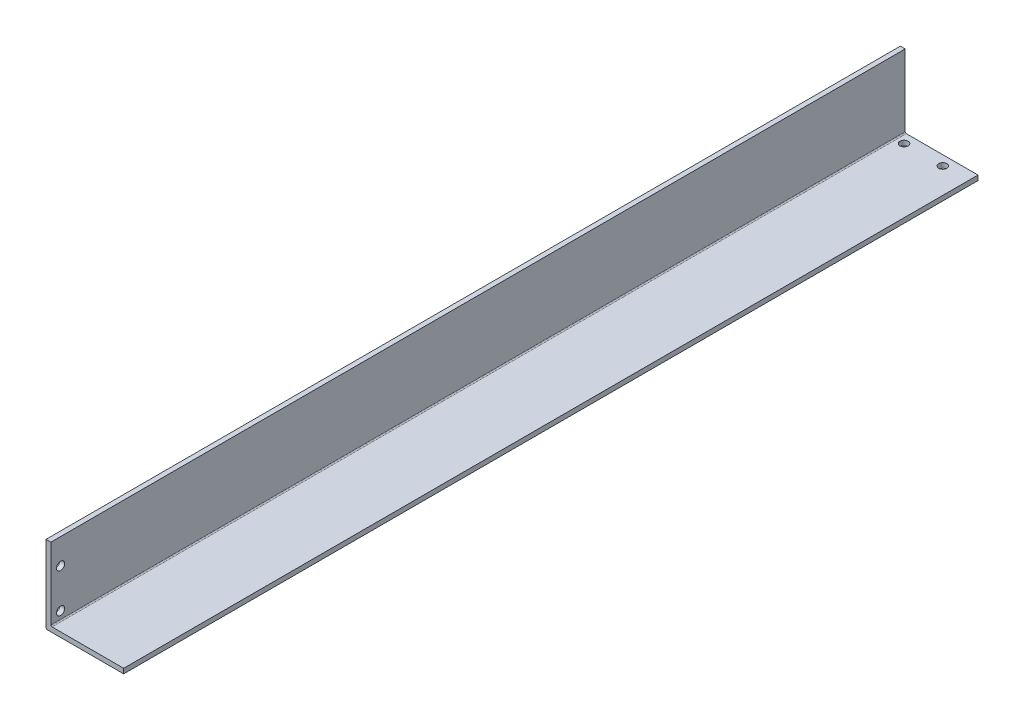
ISO-10303-21;
HEADER;
FILE_DESCRIPTION(('STEP AP214'),'2;1');
FILE_NAME('part.step','',(''),(''),'','','');
FILE_SCHEMA(('AUTOMOTIVE_DESIGN { 1 0 10303 214 1 1 1 1 }'));
ENDSEC;
DATA;
#1=APPLICATION_CONTEXT('core data for automotive mechanical design processes');
#2=APPLICATION_PROTOCOL_DEFINITION('international standard','automotive_design',2000,#1);
#3=PRODUCT_CONTEXT('',#1,'mechanical');
#4=PRODUCT('Part','Part','',(#3));
#5=PRODUCT_RELATED_PRODUCT_CATEGORY('part','',(#4));
#6=PRODUCT_DEFINITION_FORMATION('','',#4);
#7=PRODUCT_DEFINITION_CONTEXT('part definition',#1,'design');
#8=PRODUCT_DEFINITION('design','',#6,#7);
#9=PRODUCT_DEFINITION_SHAPE('','',#8);
#10=(LENGTH_UNIT() NAMED_UNIT(*) SI_UNIT(.MILLI.,.METRE.));
#11=(NAMED_UNIT(*) PLANE_ANGLE_UNIT() SI_UNIT($,.RADIAN.));
#12=(NAMED_UNIT(*) SI_UNIT($,.STERADIAN.) SOLID_ANGLE_UNIT());
#13=UNCERTAINTY_MEASURE_WITH_UNIT(LENGTH_MEASURE(1.E-05),#10,'distance_accuracy_value','');
#14=(GEOMETRIC_REPRESENTATION_CONTEXT(3) GLOBAL_UNCERTAINTY_ASSIGNED_CONTEXT((#13)) GLOBAL_UNIT_ASSIGNED_CONTEXT((#10,
#11,#12)) REPRESENTATION_CONTEXT('',''));
#15=CARTESIAN_POINT('',(0.,0.,0.));
#16=DIRECTION('',(0.,0.,1.));
#17=DIRECTION('',(1.,0.,0.));
#18=AXIS2_PLACEMENT_3D('',#15,#16,#17);
#19=CARTESIAN_POINT('',(0.,50.8,558.8));
#20=DIRECTION('',(0.,-1.,0.));
#21=DIRECTION('',(0.,0.,-1.));
#22=AXIS2_PLACEMENT_3D('',#19,#20,#21);
#23=PLANE('',#22);
#24=DIRECTION('',(-1.,0.,0.));
#25=VECTOR('',#24,1.);
#26=CARTESIAN_POINT('',(0.,50.8,0.));
#27=LINE('',#26,#25);
#28=CARTESIAN_POINT('',(3.17499999999999,50.8,0.));
#29=VERTEX_POINT('',#28);
#30=CARTESIAN_POINT('',(0.,50.8,0.));
#31=VERTEX_POINT('',#30);
#32=EDGE_CURVE('E129',#29,#31,#27,.T.);
#33=ORIENTED_EDGE('',*,*,#32,.T.);
#34=DIRECTION('',(0.,0.,-1.));
#35=VECTOR('',#34,1.);
#36=CARTESIAN_POINT('',(0.,50.8,558.8));
#37=LINE('',#36,#35);
#38=CARTESIAN_POINT('',(0.,50.8,558.8));
#39=VERTEX_POINT('',#38);
#40=EDGE_CURVE('E11',#39,#31,#37,.T.);
#41=ORIENTED_EDGE('',*,*,#40,.F.);
#42=DIRECTION('',(-1.,0.,0.));
#43=VECTOR('',#42,1.);
#44=CARTESIAN_POINT('',(0.,50.8,558.8));
#45=LINE('',#44,#43);
#46=CARTESIAN_POINT('',(3.17499999999999,50.8,558.8));
#47=VERTEX_POINT('',#46);
#48=EDGE_CURVE('E144',#47,#39,#45,.T.);
#49=ORIENTED_EDGE('',*,*,#48,.F.);
#50=DIRECTION('',(0.,0.,-1.));
#51=VECTOR('',#50,1.);
#52=CARTESIAN_POINT('',(3.17499999999999,50.8,558.8));
#53=LINE('',#52,#51);
#54=EDGE_CURVE('E125',#47,#29,#53,.T.);
#55=ORIENTED_EDGE('',*,*,#54,.T.);
#56=EDGE_LOOP('',(#33,#41,#49,#55));
#57=FACE_BOUND('',#56,.T.);
#58=ADVANCED_FACE('F33',(#57),#23,.F.);
#59=CARTESIAN_POINT('',(0.,0.762000000000005,558.8));
#60=DIRECTION('',(1.,0.,0.));
#61=DIRECTION('',(0.,0.,-1.));
#62=AXIS2_PLACEMENT_3D('',#59,#60,#61);
#63=PLANE('',#62);
#64=CARTESIAN_POINT('',(0.,8.763,552.45));
#65=DIRECTION('',(1.,0.,0.));
#66=DIRECTION('',(0.,1.,0.));
#67=AXIS2_PLACEMENT_3D('',#64,#65,#66);
#68=CIRCLE('',#67,2.66700000000002);
#69=CARTESIAN_POINT('',(0.,11.43,552.45));
#70=VERTEX_POINT('',#69);
#71=EDGE_CURVE('E195',#70,#70,#68,.T.);
#72=ORIENTED_EDGE('',*,*,#71,.T.);
#73=EDGE_LOOP('',(#72));
#74=FACE_BOUND('',#73,.T.);
#75=CARTESIAN_POINT('',(0.,34.163,552.45));
#76=DIRECTION('',(1.,0.,0.));
#77=DIRECTION('',(0.,1.,0.));
#78=AXIS2_PLACEMENT_3D('',#75,#76,#77);
#79=CIRCLE('',#78,2.66700000000002);
#80=CARTESIAN_POINT('',(0.,36.83,552.45));
#81=VERTEX_POINT('',#80);
#82=EDGE_CURVE('E186',#81,#81,#79,.T.);
#83=ORIENTED_EDGE('',*,*,#82,.T.);
#84=EDGE_LOOP('',(#83));
#85=FACE_BOUND('',#84,.T.);
#86=DIRECTION('',(0.,-1.,0.));
#87=VECTOR('',#86,1.);
#88=CARTESIAN_POINT('',(0.,0.762000000000005,0.));
#89=LINE('',#88,#87);
#90=CARTESIAN_POINT('',(0.,0.762000000000005,0.));
#91=VERTEX_POINT('',#90);
#92=EDGE_CURVE('E132',#31,#91,#89,.T.);
#93=ORIENTED_EDGE('',*,*,#92,.T.);
#94=DIRECTION('',(0.,0.,-1.));
#95=VECTOR('',#94,1.);
#96=CARTESIAN_POINT('',(0.,0.762000000000005,558.8));
#97=LINE('',#96,#95);
#98=CARTESIAN_POINT('',(0.,0.762000000000005,558.8));
#99=VERTEX_POINT('',#98);
#100=EDGE_CURVE('E41',#99,#91,#97,.T.);
#101=ORIENTED_EDGE('',*,*,#100,.F.);
#102=DIRECTION('',(0.,-1.,0.));
#103=VECTOR('',#102,1.);
#104=CARTESIAN_POINT('',(0.,0.762000000000005,558.8));
#105=LINE('',#104,#103);
#106=EDGE_CURVE('E92',#39,#99,#105,.T.);
#107=ORIENTED_EDGE('',*,*,#106,.F.);
#108=ORIENTED_EDGE('',*,*,#40,.T.);
#109=EDGE_LOOP('',(#93,#101,#107,#108));
#110=FACE_BOUND('',#109,.T.);
#111=ADVANCED_FACE('F225',(#74,#85,#110),#63,.F.);
#112=CARTESIAN_POINT('',(0.762,0.762,558.8));
#113=DIRECTION('',(0.,0.,-1.));
#114=DIRECTION('',(-1.,0.,0.));
#115=AXIS2_PLACEMENT_3D('',#112,#113,#114);
#116=CYLINDRICAL_SURFACE('',#115,0.762);
#117=CARTESIAN_POINT('',(0.762,0.762,0.));
#118=DIRECTION('',(0.,0.,1.));
#119=DIRECTION('',(1.,0.,0.));
#120=AXIS2_PLACEMENT_3D('',#117,#118,#119);
#121=CIRCLE('',#120,0.762);
#122=CARTESIAN_POINT('',(0.762000000000005,0.,0.));
#123=VERTEX_POINT('',#122);
#124=EDGE_CURVE('E135',#91,#123,#121,.T.);
#125=ORIENTED_EDGE('',*,*,#124,.T.);
#126=DIRECTION('',(0.,0.,-1.));
#127=VECTOR('',#126,1.);
#128=CARTESIAN_POINT('',(0.762000000000005,0.,558.8));
#129=LINE('',#128,#127);
#130=CARTESIAN_POINT('',(0.762000000000005,0.,558.8));
#131=VERTEX_POINT('',#130);
#132=EDGE_CURVE('E151',#131,#123,#129,.T.);
#133=ORIENTED_EDGE('',*,*,#132,.F.);
#134=CARTESIAN_POINT('',(0.762,0.762,558.8));
#135=DIRECTION('',(0.,0.,1.));
#136=DIRECTION('',(1.,0.,0.));
#137=AXIS2_PLACEMENT_3D('',#134,#135,#136);
#138=CIRCLE('',#137,0.762);
#139=EDGE_CURVE('E159',#99,#131,#138,.T.);
#140=ORIENTED_EDGE('',*,*,#139,.F.);
#141=ORIENTED_EDGE('',*,*,#100,.T.);
#142=EDGE_LOOP('',(#125,#133,#140,#141));
#143=FACE_BOUND('',#142,.T.);
#144=ADVANCED_FACE('F157',(#143),#116,.T.);
#145=CARTESIAN_POINT('',(0.762000000000005,0.,558.8));
#146=DIRECTION('',(0.,1.,0.));
#147=DIRECTION('',(0.,0.,1.));
#148=AXIS2_PLACEMENT_3D('',#145,#146,#147);
#149=PLANE('',#148);
#150=CARTESIAN_POINT('',(8.763,0.,6.35));
#151=DIRECTION('',(0.,1.,0.));
#152=DIRECTION('',(0.,0.,1.));
#153=AXIS2_PLACEMENT_3D('',#150,#151,#152);
#154=CIRCLE('',#153,2.667);
#155=CARTESIAN_POINT('',(8.763,0.,9.017));
#156=VERTEX_POINT('',#155);
#157=EDGE_CURVE('E183',#156,#156,#154,.T.);
#158=ORIENTED_EDGE('',*,*,#157,.T.);
#159=EDGE_LOOP('',(#158));
#160=FACE_BOUND('',#159,.T.);
#161=CARTESIAN_POINT('',(34.163,0.,6.35));
#162=DIRECTION('',(0.,1.,0.));
#163=DIRECTION('',(0.,0.,1.));
#164=AXIS2_PLACEMENT_3D('',#161,#162,#163);
#165=CIRCLE('',#164,2.667);
#166=CARTESIAN_POINT('',(34.163,0.,9.017));
#167=VERTEX_POINT('',#166);
#168=EDGE_CURVE('E133',#167,#167,#165,.T.);
#169=ORIENTED_EDGE('',*,*,#168,.T.);
#170=EDGE_LOOP('',(#169));
#171=FACE_BOUND('',#170,.T.);
#172=DIRECTION('',(1.,0.,0.));
#173=VECTOR('',#172,1.);
#174=CARTESIAN_POINT('',(0.762000000000005,0.,0.));
#175=LINE('',#174,#173);
#176=CARTESIAN_POINT('',(50.8,0.,0.));
#177=VERTEX_POINT('',#176);
#178=EDGE_CURVE('E137',#123,#177,#175,.T.);
#179=ORIENTED_EDGE('',*,*,#178,.T.);
#180=DIRECTION('',(0.,0.,-1.));
#181=VECTOR('',#180,1.);
#182=CARTESIAN_POINT('',(50.8,0.,558.8));
#183=LINE('',#182,#181);
#184=CARTESIAN_POINT('',(50.8,0.,558.8));
#185=VERTEX_POINT('',#184);
#186=EDGE_CURVE('E148',#185,#177,#183,.T.);
#187=ORIENTED_EDGE('',*,*,#186,.F.);
#188=DIRECTION('',(1.,0.,0.));
#189=VECTOR('',#188,1.);
#190=CARTESIAN_POINT('',(0.762000000000005,0.,558.8));
#191=LINE('',#190,#189);
#192=EDGE_CURVE('E171',#131,#185,#191,.T.);
#193=ORIENTED_EDGE('',*,*,#192,.F.);
#194=ORIENTED_EDGE('',*,*,#132,.T.);
#195=EDGE_LOOP('',(#179,#187,#193,#194));
#196=FACE_BOUND('',#195,.T.);
#197=ADVANCED_FACE('F167',(#160,#171,#196),#149,.F.);
#198=CARTESIAN_POINT('',(50.8,0.,558.8));
#199=DIRECTION('',(-1.,0.,0.));
#200=DIRECTION('',(0.,0.,1.));
#201=AXIS2_PLACEMENT_3D('',#198,#199,#200);
#202=PLANE('',#201);
#203=DIRECTION('',(0.,1.,0.));
#204=VECTOR('',#203,1.);
#205=CARTESIAN_POINT('',(50.8,0.,0.));
#206=LINE('',#205,#204);
#207=CARTESIAN_POINT('',(50.8,3.175,0.));
#208=VERTEX_POINT('',#207);
#209=EDGE_CURVE('E139',#177,#208,#206,.T.);
#210=ORIENTED_EDGE('',*,*,#209,.T.);
#211=DIRECTION('',(0.,0.,-1.));
#212=VECTOR('',#211,1.);
#213=CARTESIAN_POINT('',(50.8,3.175,558.8));
#214=LINE('',#213,#212);
#215=CARTESIAN_POINT('',(50.8,3.175,558.8));
#216=VERTEX_POINT('',#215);
#217=EDGE_CURVE('E120',#216,#208,#214,.T.);
#218=ORIENTED_EDGE('',*,*,#217,.F.);
#219=DIRECTION('',(0.,1.,0.));
#220=VECTOR('',#219,1.);
#221=CARTESIAN_POINT('',(50.8,0.,558.8));
#222=LINE('',#221,#220);
#223=EDGE_CURVE('E111',#185,#216,#222,.T.);
#224=ORIENTED_EDGE('',*,*,#223,.F.);
#225=ORIENTED_EDGE('',*,*,#186,.T.);
#226=EDGE_LOOP('',(#210,#218,#224,#225));
#227=FACE_BOUND('',#226,.T.);
#228=ADVANCED_FACE('F170',(#227),#202,.F.);
#229=CARTESIAN_POINT('',(3.93699999999999,3.175,558.8));
#230=DIRECTION('',(0.,-1.,0.));
#231=DIRECTION('',(0.,0.,-1.));
#232=AXIS2_PLACEMENT_3D('',#229,#230,#231);
#233=PLANE('',#232);
#234=CARTESIAN_POINT('',(8.763,3.175,6.35));
#235=DIRECTION('',(0.,1.,0.));
#236=DIRECTION('',(0.,0.,1.));
#237=AXIS2_PLACEMENT_3D('',#234,#235,#236);
#238=CIRCLE('',#237,2.667);
#239=CARTESIAN_POINT('',(8.763,3.175,9.017));
#240=VERTEX_POINT('',#239);
#241=EDGE_CURVE('E180',#240,#240,#238,.T.);
#242=ORIENTED_EDGE('',*,*,#241,.F.);
#243=EDGE_LOOP('',(#242));
#244=FACE_BOUND('',#243,.T.);
#245=CARTESIAN_POINT('',(34.163,3.175,6.35));
#246=DIRECTION('',(0.,1.,0.));
#247=DIRECTION('',(0.,0.,1.));
#248=AXIS2_PLACEMENT_3D('',#245,#246,#247);
#249=CIRCLE('',#248,2.667);
#250=CARTESIAN_POINT('',(34.163,3.175,9.017));
#251=VERTEX_POINT('',#250);
#252=EDGE_CURVE('E177',#251,#251,#249,.T.);
#253=ORIENTED_EDGE('',*,*,#252,.F.);
#254=EDGE_LOOP('',(#253));
#255=FACE_BOUND('',#254,.T.);
#256=DIRECTION('',(-1.,0.,0.));
#257=VECTOR('',#256,1.);
#258=CARTESIAN_POINT('',(3.93699999999999,3.175,0.));
#259=LINE('',#258,#257);
#260=CARTESIAN_POINT('',(3.93699999999999,3.175,0.));
#261=VERTEX_POINT('',#260);
#262=EDGE_CURVE('E119',#208,#261,#259,.T.);
#263=ORIENTED_EDGE('',*,*,#262,.T.);
#264=DIRECTION('',(0.,0.,-1.));
#265=VECTOR('',#264,1.);
#266=CARTESIAN_POINT('',(3.93699999999999,3.175,558.8));
#267=LINE('',#266,#265);
#268=CARTESIAN_POINT('',(3.93699999999999,3.175,558.8));
#269=VERTEX_POINT('',#268);
#270=EDGE_CURVE('E116',#269,#261,#267,.T.);
#271=ORIENTED_EDGE('',*,*,#270,.F.);
#272=DIRECTION('',(-1.,0.,0.));
#273=VECTOR('',#272,1.);
#274=CARTESIAN_POINT('',(3.93699999999999,3.175,558.8));
#275=LINE('',#274,#273);
#276=EDGE_CURVE('E105',#216,#269,#275,.T.);
#277=ORIENTED_EDGE('',*,*,#276,.F.);
#278=ORIENTED_EDGE('',*,*,#217,.T.);
#279=EDGE_LOOP('',(#263,#271,#277,#278));
#280=FACE_BOUND('',#279,.T.);
#281=ADVANCED_FACE('F117',(#244,#255,#280),#233,.F.);
#282=CARTESIAN_POINT('',(3.93699999999999,3.937,558.8));
#283=DIRECTION('',(0.,0.,-1.));
#284=DIRECTION('',(-1.,0.,0.));
#285=AXIS2_PLACEMENT_3D('',#282,#283,#284);
#286=CYLINDRICAL_SURFACE('',#285,0.762);
#287=CARTESIAN_POINT('',(3.93699999999999,3.937,0.));
#288=DIRECTION('',(0.,0.,-1.));
#289=DIRECTION('',(1.,0.,0.));
#290=AXIS2_PLACEMENT_3D('',#287,#288,#289);
#291=CIRCLE('',#290,0.762);
#292=CARTESIAN_POINT('',(3.17499999999999,3.937,0.));
#293=VERTEX_POINT('',#292);
#294=EDGE_CURVE('E78',#261,#293,#291,.T.);
#295=ORIENTED_EDGE('',*,*,#294,.T.);
#296=DIRECTION('',(0.,0.,-1.));
#297=VECTOR('',#296,1.);
#298=CARTESIAN_POINT('',(3.17499999999999,3.937,558.8));
#299=LINE('',#298,#297);
#300=CARTESIAN_POINT('',(3.17499999999999,3.937,558.8));
#301=VERTEX_POINT('',#300);
#302=EDGE_CURVE('E121',#301,#293,#299,.T.);
#303=ORIENTED_EDGE('',*,*,#302,.F.);
#304=CARTESIAN_POINT('',(3.93699999999999,3.937,558.8));
#305=DIRECTION('',(0.,0.,-1.));
#306=DIRECTION('',(1.,0.,0.));
#307=AXIS2_PLACEMENT_3D('',#304,#305,#306);
#308=CIRCLE('',#307,0.762);
#309=EDGE_CURVE('E109',#269,#301,#308,.T.);
#310=ORIENTED_EDGE('',*,*,#309,.F.);
#311=ORIENTED_EDGE('',*,*,#270,.T.);
#312=EDGE_LOOP('',(#295,#303,#310,#311));
#313=FACE_BOUND('',#312,.T.);
#314=ADVANCED_FACE('F123',(#313),#286,.F.);
#315=CARTESIAN_POINT('',(3.17499999999999,50.8,558.8));
#316=DIRECTION('',(-1.,0.,0.));
#317=DIRECTION('',(0.,-1.,0.));
#318=AXIS2_PLACEMENT_3D('',#315,#316,#317);
#319=PLANE('',#318);
#320=CARTESIAN_POINT('',(3.17499999999999,8.763,552.45));
#321=DIRECTION('',(1.,0.,0.));
#322=DIRECTION('',(0.,1.,0.));
#323=AXIS2_PLACEMENT_3D('',#320,#321,#322);
#324=CIRCLE('',#323,2.66700000000002);
#325=CARTESIAN_POINT('',(3.17499999999999,11.43,552.45));
#326=VERTEX_POINT('',#325);
#327=EDGE_CURVE('E192',#326,#326,#324,.T.);
#328=ORIENTED_EDGE('',*,*,#327,.F.);
#329=EDGE_LOOP('',(#328));
#330=FACE_BOUND('',#329,.T.);
#331=CARTESIAN_POINT('',(3.17499999999999,34.163,552.45));
#332=DIRECTION('',(1.,0.,0.));
#333=DIRECTION('',(0.,1.,0.));
#334=AXIS2_PLACEMENT_3D('',#331,#332,#333);
#335=CIRCLE('',#334,2.66700000000002);
#336=CARTESIAN_POINT('',(3.17499999999999,36.83,552.45));
#337=VERTEX_POINT('',#336);
#338=EDGE_CURVE('E189',#337,#337,#335,.T.);
#339=ORIENTED_EDGE('',*,*,#338,.F.);
#340=EDGE_LOOP('',(#339));
#341=FACE_BOUND('',#340,.T.);
#342=DIRECTION('',(0.,1.,0.));
#343=VECTOR('',#342,1.);
#344=CARTESIAN_POINT('',(3.17499999999999,50.8,0.));
#345=LINE('',#344,#343);
#346=EDGE_CURVE('E84',#293,#29,#345,.T.);
#347=ORIENTED_EDGE('',*,*,#346,.T.);
#348=ORIENTED_EDGE('',*,*,#54,.F.);
#349=DIRECTION('',(0.,1.,0.));
#350=VECTOR('',#349,1.);
#351=CARTESIAN_POINT('',(3.17499999999999,50.8,558.8));
#352=LINE('',#351,#350);
#353=EDGE_CURVE('E49',#301,#47,#352,.T.);
#354=ORIENTED_EDGE('',*,*,#353,.F.);
#355=ORIENTED_EDGE('',*,*,#302,.T.);
#356=EDGE_LOOP('',(#347,#348,#354,#355));
#357=FACE_BOUND('',#356,.T.);
#358=ADVANCED_FACE('F203',(#330,#341,#357),#319,.F.);
#359=CARTESIAN_POINT('',(3.93699999999999,3.937,558.8));
#360=DIRECTION('',(0.,0.,1.));
#361=DIRECTION('',(1.,0.,0.));
#362=AXIS2_PLACEMENT_3D('',#359,#360,#361);
#363=PLANE('',#362);
#364=ORIENTED_EDGE('',*,*,#48,.T.);
#365=ORIENTED_EDGE('',*,*,#106,.T.);
#366=ORIENTED_EDGE('',*,*,#139,.T.);
#367=ORIENTED_EDGE('',*,*,#192,.T.);
#368=ORIENTED_EDGE('',*,*,#223,.T.);
#369=ORIENTED_EDGE('',*,*,#276,.T.);
#370=ORIENTED_EDGE('',*,*,#309,.T.);
#371=ORIENTED_EDGE('',*,*,#353,.T.);
#372=EDGE_LOOP('',(#364,#365,#366,#367,#368,#369,#370,#371));
#373=FACE_BOUND('',#372,.T.);
#374=ADVANCED_FACE('F107',(#373),#363,.T.);
#375=CARTESIAN_POINT('',(3.93699999999999,3.937,0.));
#376=DIRECTION('',(0.,0.,1.));
#377=DIRECTION('',(1.,0.,0.));
#378=AXIS2_PLACEMENT_3D('',#375,#376,#377);
#379=PLANE('',#378);
#380=ORIENTED_EDGE('',*,*,#32,.F.);
#381=ORIENTED_EDGE('',*,*,#346,.F.);
#382=ORIENTED_EDGE('',*,*,#294,.F.);
#383=ORIENTED_EDGE('',*,*,#262,.F.);
#384=ORIENTED_EDGE('',*,*,#209,.F.);
#385=ORIENTED_EDGE('',*,*,#178,.F.);
#386=ORIENTED_EDGE('',*,*,#124,.F.);
#387=ORIENTED_EDGE('',*,*,#92,.F.);
#388=EDGE_LOOP('',(#380,#381,#382,#383,#384,#385,#386,#387));
#389=FACE_BOUND('',#388,.T.);
#390=ADVANCED_FACE('F163',(#389),#379,.F.);
#391=CARTESIAN_POINT('',(34.163,0.,6.35));
#392=DIRECTION('',(0.,1.,0.));
#393=DIRECTION('',(0.,0.,1.));
#394=AXIS2_PLACEMENT_3D('',#391,#392,#393);
#395=CYLINDRICAL_SURFACE('',#394,2.667);
#396=ORIENTED_EDGE('',*,*,#168,.F.);
#397=EDGE_LOOP('',(#396));
#398=FACE_BOUND('',#397,.T.);
#399=ORIENTED_EDGE('',*,*,#252,.T.);
#400=EDGE_LOOP('',(#399));
#401=FACE_BOUND('',#400,.T.);
#402=ADVANCED_FACE('F220',(#398,#401),#395,.F.);
#403=CARTESIAN_POINT('',(8.763,0.,6.35));
#404=DIRECTION('',(0.,1.,0.));
#405=DIRECTION('',(0.,0.,1.));
#406=AXIS2_PLACEMENT_3D('',#403,#404,#405);
#407=CYLINDRICAL_SURFACE('',#406,2.667);
#408=ORIENTED_EDGE('',*,*,#157,.F.);
#409=EDGE_LOOP('',(#408));
#410=FACE_BOUND('',#409,.T.);
#411=ORIENTED_EDGE('',*,*,#241,.T.);
#412=EDGE_LOOP('',(#411));
#413=FACE_BOUND('',#412,.T.);
#414=ADVANCED_FACE('F211',(#410,#413),#407,.F.);
#415=CARTESIAN_POINT('',(0.,34.163,552.45));
#416=DIRECTION('',(1.,0.,0.));
#417=DIRECTION('',(0.,1.,0.));
#418=AXIS2_PLACEMENT_3D('',#415,#416,#417);
#419=CYLINDRICAL_SURFACE('',#418,2.66700000000002);
#420=ORIENTED_EDGE('',*,*,#82,.F.);
#421=EDGE_LOOP('',(#420));
#422=FACE_BOUND('',#421,.T.);
#423=ORIENTED_EDGE('',*,*,#338,.T.);
#424=EDGE_LOOP('',(#423));
#425=FACE_BOUND('',#424,.T.);
#426=ADVANCED_FACE('F209',(#422,#425),#419,.F.);
#427=CARTESIAN_POINT('',(0.,8.763,552.45));
#428=DIRECTION('',(1.,0.,0.));
#429=DIRECTION('',(0.,1.,0.));
#430=AXIS2_PLACEMENT_3D('',#427,#428,#429);
#431=CYLINDRICAL_SURFACE('',#430,2.66700000000002);
#432=ORIENTED_EDGE('',*,*,#71,.F.);
#433=EDGE_LOOP('',(#432));
#434=FACE_BOUND('',#433,.T.);
#435=ORIENTED_EDGE('',*,*,#327,.T.);
#436=EDGE_LOOP('',(#435));
#437=FACE_BOUND('',#436,.T.);
#438=ADVANCED_FACE('F201',(#434,#437),#431,.F.);
#439=CLOSED_SHELL('',(#58,#111,#144,#197,#228,#281,#314,#358,#374,#390,#402,#414,#426,#438));
#440=MANIFOLD_SOLID_BREP('B2',#439);
#441=ADVANCED_BREP_SHAPE_REPRESENTATION('',(#18,#440),#14);
#442=SHAPE_DEFINITION_REPRESENTATION(#9,#441);
ENDSEC;
END-ISO-10303-21;
